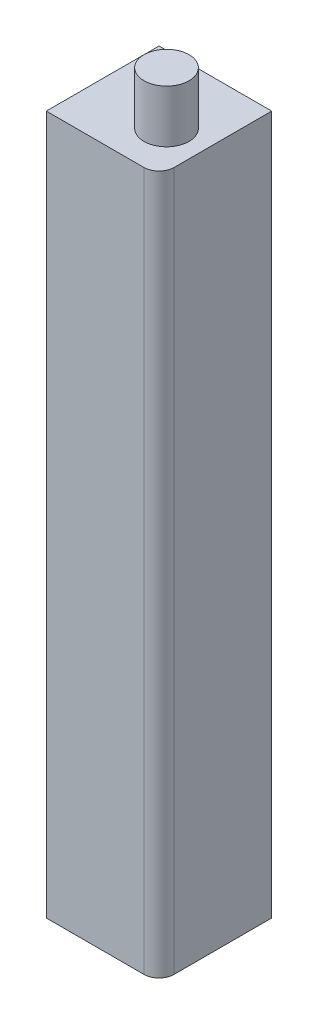
ISO-10303-21;
HEADER;
FILE_DESCRIPTION(('STEP AP214'),'2;1');
FILE_NAME('part.step','',(''),(''),'','','');
FILE_SCHEMA(('AUTOMOTIVE_DESIGN { 1 0 10303 214 1 1 1 1 }'));
ENDSEC;
DATA;
#1=APPLICATION_CONTEXT('core data for automotive mechanical design processes');
#2=APPLICATION_PROTOCOL_DEFINITION('international standard','automotive_design',2000,#1);
#3=PRODUCT_CONTEXT('',#1,'mechanical');
#4=PRODUCT('Part','Part','',(#3));
#5=PRODUCT_RELATED_PRODUCT_CATEGORY('part','',(#4));
#6=PRODUCT_DEFINITION_FORMATION('','',#4);
#7=PRODUCT_DEFINITION_CONTEXT('part definition',#1,'design');
#8=PRODUCT_DEFINITION('design','',#6,#7);
#9=PRODUCT_DEFINITION_SHAPE('','',#8);
#10=(LENGTH_UNIT() NAMED_UNIT(*) SI_UNIT(.MILLI.,.METRE.));
#11=(NAMED_UNIT(*) PLANE_ANGLE_UNIT() SI_UNIT($,.RADIAN.));
#12=(NAMED_UNIT(*) SI_UNIT($,.STERADIAN.) SOLID_ANGLE_UNIT());
#13=UNCERTAINTY_MEASURE_WITH_UNIT(LENGTH_MEASURE(1.E-05),#10,'distance_accuracy_value','');
#14=(GEOMETRIC_REPRESENTATION_CONTEXT(3) GLOBAL_UNCERTAINTY_ASSIGNED_CONTEXT((#13)) GLOBAL_UNIT_ASSIGNED_CONTEXT((#10,
#11,#12)) REPRESENTATION_CONTEXT('',''));
#15=CARTESIAN_POINT('',(0.,0.,0.));
#16=DIRECTION('',(0.,0.,1.));
#17=DIRECTION('',(1.,0.,0.));
#18=AXIS2_PLACEMENT_3D('',#15,#16,#17);
#19=CARTESIAN_POINT('',(7.5,93.,7.5));
#20=DIRECTION('',(-1.,0.,0.));
#21=DIRECTION('',(0.,0.,1.));
#22=AXIS2_PLACEMENT_3D('',#19,#20,#21);
#23=PLANE('',#22);
#24=DIRECTION('',(0.,0.,-1.));
#25=VECTOR('',#24,1.);
#26=CARTESIAN_POINT('',(7.5,93.,7.5));
#27=LINE('',#26,#25);
#28=CARTESIAN_POINT('',(7.5,93.,5.5));
#29=VERTEX_POINT('',#28);
#30=CARTESIAN_POINT('',(7.5,93.,-7.5));
#31=VERTEX_POINT('',#30);
#32=EDGE_CURVE('E78',#29,#31,#27,.T.);
#33=ORIENTED_EDGE('',*,*,#32,.F.);
#34=DIRECTION('',(0.,-1.,0.));
#35=VECTOR('',#34,1.);
#36=CARTESIAN_POINT('',(7.5,93.,5.5));
#37=LINE('',#36,#35);
#38=CARTESIAN_POINT('',(7.5,0.,5.5));
#39=VERTEX_POINT('',#38);
#40=EDGE_CURVE('E104',#29,#39,#37,.T.);
#41=ORIENTED_EDGE('',*,*,#40,.T.);
#42=DIRECTION('',(0.,0.,-1.));
#43=VECTOR('',#42,1.);
#44=CARTESIAN_POINT('',(7.5,0.,7.5));
#45=LINE('',#44,#43);
#46=CARTESIAN_POINT('',(7.5,0.,-7.5));
#47=VERTEX_POINT('',#46);
#48=EDGE_CURVE('E99',#39,#47,#45,.T.);
#49=ORIENTED_EDGE('',*,*,#48,.T.);
#50=DIRECTION('',(0.,-1.,0.));
#51=VECTOR('',#50,1.);
#52=CARTESIAN_POINT('',(7.5,93.,-7.5));
#53=LINE('',#52,#51);
#54=EDGE_CURVE('E93',#31,#47,#53,.T.);
#55=ORIENTED_EDGE('',*,*,#54,.F.);
#56=EDGE_LOOP('',(#33,#41,#49,#55));
#57=FACE_BOUND('',#56,.T.);
#58=ADVANCED_FACE('F32',(#57),#23,.F.);
#59=CARTESIAN_POINT('',(-7.5,93.,-7.5));
#60=DIRECTION('',(0.,0.,1.));
#61=DIRECTION('',(1.,0.,0.));
#62=AXIS2_PLACEMENT_3D('',#59,#60,#61);
#63=PLANE('',#62);
#64=DIRECTION('',(-1.,0.,0.));
#65=VECTOR('',#64,1.);
#66=CARTESIAN_POINT('',(-7.5,0.,-7.5));
#67=LINE('',#66,#65);
#68=CARTESIAN_POINT('',(-7.5,0.,-7.5));
#69=VERTEX_POINT('',#68);
#70=EDGE_CURVE('E114',#47,#69,#67,.T.);
#71=ORIENTED_EDGE('',*,*,#70,.T.);
#72=DIRECTION('',(0.,-1.,0.));
#73=VECTOR('',#72,1.);
#74=CARTESIAN_POINT('',(-7.5,93.,-7.5));
#75=LINE('',#74,#73);
#76=CARTESIAN_POINT('',(-7.5,93.,-7.5));
#77=VERTEX_POINT('',#76);
#78=EDGE_CURVE('E95',#77,#69,#75,.T.);
#79=ORIENTED_EDGE('',*,*,#78,.F.);
#80=DIRECTION('',(-1.,0.,0.));
#81=VECTOR('',#80,1.);
#82=CARTESIAN_POINT('',(-7.5,93.,-7.5));
#83=LINE('',#82,#81);
#84=EDGE_CURVE('E81',#31,#77,#83,.T.);
#85=ORIENTED_EDGE('',*,*,#84,.F.);
#86=ORIENTED_EDGE('',*,*,#54,.T.);
#87=EDGE_LOOP('',(#71,#79,#85,#86));
#88=FACE_BOUND('',#87,.T.);
#89=ADVANCED_FACE('F92',(#88),#63,.F.);
#90=CARTESIAN_POINT('',(-7.5,93.,7.5));
#91=DIRECTION('',(1.,0.,0.));
#92=DIRECTION('',(0.,0.,-1.));
#93=AXIS2_PLACEMENT_3D('',#90,#91,#92);
#94=PLANE('',#93);
#95=DIRECTION('',(0.,0.,1.));
#96=VECTOR('',#95,1.);
#97=CARTESIAN_POINT('',(-7.5,0.,7.5));
#98=LINE('',#97,#96);
#99=CARTESIAN_POINT('',(-7.5,0.,7.5));
#100=VERTEX_POINT('',#99);
#101=EDGE_CURVE('E117',#69,#100,#98,.T.);
#102=ORIENTED_EDGE('',*,*,#101,.T.);
#103=DIRECTION('',(0.,-1.,0.));
#104=VECTOR('',#103,1.);
#105=CARTESIAN_POINT('',(-7.5,93.,7.5));
#106=LINE('',#105,#104);
#107=CARTESIAN_POINT('',(-7.5,93.,7.5));
#108=VERTEX_POINT('',#107);
#109=EDGE_CURVE('E106',#108,#100,#106,.T.);
#110=ORIENTED_EDGE('',*,*,#109,.F.);
#111=DIRECTION('',(0.,0.,1.));
#112=VECTOR('',#111,1.);
#113=CARTESIAN_POINT('',(-7.5,93.,7.5));
#114=LINE('',#113,#112);
#115=EDGE_CURVE('E97',#77,#108,#114,.T.);
#116=ORIENTED_EDGE('',*,*,#115,.F.);
#117=ORIENTED_EDGE('',*,*,#78,.T.);
#118=EDGE_LOOP('',(#102,#110,#116,#117));
#119=FACE_BOUND('',#118,.T.);
#120=ADVANCED_FACE('F129',(#119),#94,.F.);
#121=CARTESIAN_POINT('',(-7.5,93.,7.5));
#122=DIRECTION('',(0.,0.,-1.));
#123=DIRECTION('',(-1.,0.,0.));
#124=AXIS2_PLACEMENT_3D('',#121,#122,#123);
#125=PLANE('',#124);
#126=DIRECTION('',(1.,0.,0.));
#127=VECTOR('',#126,1.);
#128=CARTESIAN_POINT('',(-7.5,0.,7.5));
#129=LINE('',#128,#127);
#130=CARTESIAN_POINT('',(5.49999999999999,0.,7.5));
#131=VERTEX_POINT('',#130);
#132=EDGE_CURVE('E88',#100,#131,#129,.T.);
#133=ORIENTED_EDGE('',*,*,#132,.T.);
#134=DIRECTION('',(0.,-1.,0.));
#135=VECTOR('',#134,1.);
#136=CARTESIAN_POINT('',(5.5,93.,7.5));
#137=LINE('',#136,#135);
#138=CARTESIAN_POINT('',(5.49999999999999,93.,7.5));
#139=VERTEX_POINT('',#138);
#140=EDGE_CURVE('E40',#131,#139,#137,.F.);
#141=ORIENTED_EDGE('',*,*,#140,.T.);
#142=DIRECTION('',(1.,0.,0.));
#143=VECTOR('',#142,1.);
#144=CARTESIAN_POINT('',(-7.5,93.,7.5));
#145=LINE('',#144,#143);
#146=EDGE_CURVE('E122',#108,#139,#145,.T.);
#147=ORIENTED_EDGE('',*,*,#146,.F.);
#148=ORIENTED_EDGE('',*,*,#109,.T.);
#149=EDGE_LOOP('',(#133,#141,#147,#148));
#150=FACE_BOUND('',#149,.T.);
#151=ADVANCED_FACE('F130',(#150),#125,.F.);
#152=CARTESIAN_POINT('',(0.,93.,0.));
#153=DIRECTION('',(0.,-1.,0.));
#154=DIRECTION('',(0.,0.,-1.));
#155=AXIS2_PLACEMENT_3D('',#152,#153,#154);
#156=PLANE('',#155);
#157=CARTESIAN_POINT('',(2.5,93.,1.5));
#158=DIRECTION('',(0.,1.,0.));
#159=DIRECTION('',(0.,0.,1.));
#160=AXIS2_PLACEMENT_3D('',#157,#158,#159);
#161=CIRCLE('',#160,3.);
#162=CARTESIAN_POINT('',(2.5,93.,4.5));
#163=VERTEX_POINT('',#162);
#164=EDGE_CURVE('E101',#163,#163,#161,.T.);
#165=ORIENTED_EDGE('',*,*,#164,.F.);
#166=EDGE_LOOP('',(#165));
#167=FACE_BOUND('',#166,.T.);
#168=ORIENTED_EDGE('',*,*,#146,.T.);
#169=CARTESIAN_POINT('',(5.5,93.,5.5));
#170=DIRECTION('',(0.,-1.,0.));
#171=DIRECTION('',(0.,0.,-1.));
#172=AXIS2_PLACEMENT_3D('',#169,#170,#171);
#173=CIRCLE('',#172,2.);
#174=EDGE_CURVE('E11',#139,#29,#173,.F.);
#175=ORIENTED_EDGE('',*,*,#174,.T.);
#176=ORIENTED_EDGE('',*,*,#32,.T.);
#177=ORIENTED_EDGE('',*,*,#84,.T.);
#178=ORIENTED_EDGE('',*,*,#115,.T.);
#179=EDGE_LOOP('',(#168,#175,#176,#177,#178));
#180=FACE_BOUND('',#179,.T.);
#181=ADVANCED_FACE('F80',(#167,#180),#156,.F.);
#182=CARTESIAN_POINT('',(0.,0.,0.));
#183=DIRECTION('',(0.,-1.,0.));
#184=DIRECTION('',(0.,0.,-1.));
#185=AXIS2_PLACEMENT_3D('',#182,#183,#184);
#186=PLANE('',#185);
#187=ORIENTED_EDGE('',*,*,#48,.F.);
#188=CARTESIAN_POINT('',(5.5,0.,5.5));
#189=DIRECTION('',(0.,-1.,0.));
#190=DIRECTION('',(0.,0.,-1.));
#191=AXIS2_PLACEMENT_3D('',#188,#189,#190);
#192=CIRCLE('',#191,2.);
#193=EDGE_CURVE('E54',#39,#131,#192,.T.);
#194=ORIENTED_EDGE('',*,*,#193,.T.);
#195=ORIENTED_EDGE('',*,*,#132,.F.);
#196=ORIENTED_EDGE('',*,*,#101,.F.);
#197=ORIENTED_EDGE('',*,*,#70,.F.);
#198=EDGE_LOOP('',(#187,#194,#195,#196,#197));
#199=FACE_BOUND('',#198,.T.);
#200=ADVANCED_FACE('F112',(#199),#186,.T.);
#201=CARTESIAN_POINT('',(2.5,100.,1.5));
#202=DIRECTION('',(0.,-1.,0.));
#203=DIRECTION('',(0.,0.,-1.));
#204=AXIS2_PLACEMENT_3D('',#201,#202,#203);
#205=CYLINDRICAL_SURFACE('',#204,3.);
#206=CARTESIAN_POINT('',(2.5,100.,1.5));
#207=DIRECTION('',(0.,1.,0.));
#208=DIRECTION('',(0.,0.,1.));
#209=AXIS2_PLACEMENT_3D('',#206,#207,#208);
#210=CIRCLE('',#209,3.);
#211=CARTESIAN_POINT('',(2.5,100.,4.5));
#212=VERTEX_POINT('',#211);
#213=EDGE_CURVE('E115',#212,#212,#210,.T.);
#214=ORIENTED_EDGE('',*,*,#213,.F.);
#215=EDGE_LOOP('',(#214));
#216=FACE_BOUND('',#215,.T.);
#217=ORIENTED_EDGE('',*,*,#164,.T.);
#218=EDGE_LOOP('',(#217));
#219=FACE_BOUND('',#218,.T.);
#220=ADVANCED_FACE('F158',(#216,#219),#205,.T.);
#221=CARTESIAN_POINT('',(2.5,100.,1.5));
#222=DIRECTION('',(0.,1.,0.));
#223=DIRECTION('',(0.,0.,1.));
#224=AXIS2_PLACEMENT_3D('',#221,#222,#223);
#225=PLANE('',#224);
#226=ORIENTED_EDGE('',*,*,#213,.T.);
#227=EDGE_LOOP('',(#226));
#228=FACE_BOUND('',#227,.T.);
#229=ADVANCED_FACE('F163',(#228),#225,.T.);
#230=CARTESIAN_POINT('',(5.5,93.,5.5));
#231=DIRECTION('',(0.,-1.,0.));
#232=DIRECTION('',(0.,0.,-1.));
#233=AXIS2_PLACEMENT_3D('',#230,#231,#232);
#234=CYLINDRICAL_SURFACE('',#233,2.);
#235=ORIENTED_EDGE('',*,*,#174,.F.);
#236=ORIENTED_EDGE('',*,*,#140,.F.);
#237=ORIENTED_EDGE('',*,*,#193,.F.);
#238=ORIENTED_EDGE('',*,*,#40,.F.);
#239=EDGE_LOOP('',(#235,#236,#237,#238));
#240=FACE_BOUND('',#239,.T.);
#241=ADVANCED_FACE('F34',(#240),#234,.T.);
#242=CLOSED_SHELL('',(#58,#89,#120,#151,#181,#200,#220,#229,#241));
#243=MANIFOLD_SOLID_BREP('B2',#242);
#244=ADVANCED_BREP_SHAPE_REPRESENTATION('',(#18,#243),#14);
#245=SHAPE_DEFINITION_REPRESENTATION(#9,#244);
ENDSEC;
END-ISO-10303-21;
